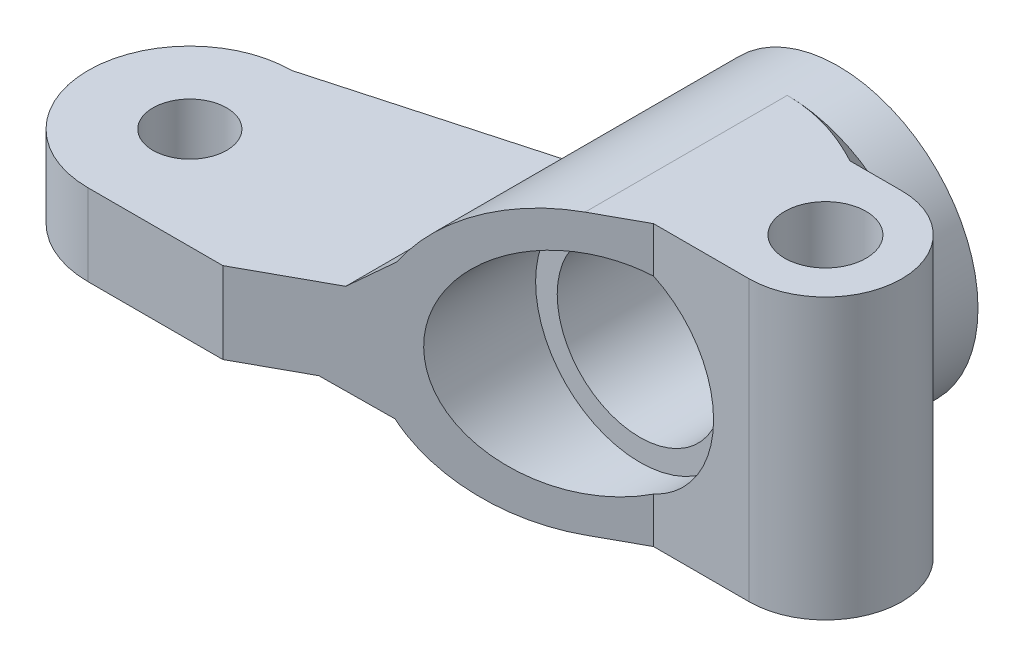
ISO-10303-21;
HEADER;
FILE_DESCRIPTION(('STEP AP214'),'2;1');
FILE_NAME('part.step','',(''),(''),'','','');
FILE_SCHEMA(('AUTOMOTIVE_DESIGN { 1 0 10303 214 1 1 1 1 }'));
ENDSEC;
DATA;
#1=APPLICATION_CONTEXT('core data for automotive mechanical design processes');
#2=APPLICATION_PROTOCOL_DEFINITION('international standard','automotive_design',2000,#1);
#3=PRODUCT_CONTEXT('',#1,'mechanical');
#4=PRODUCT('Part','Part','',(#3));
#5=PRODUCT_RELATED_PRODUCT_CATEGORY('part','',(#4));
#6=PRODUCT_DEFINITION_FORMATION('','',#4);
#7=PRODUCT_DEFINITION_CONTEXT('part definition',#1,'design');
#8=PRODUCT_DEFINITION('design','',#6,#7);
#9=PRODUCT_DEFINITION_SHAPE('','',#8);
#10=(LENGTH_UNIT() NAMED_UNIT(*) SI_UNIT(.MILLI.,.METRE.));
#11=(NAMED_UNIT(*) PLANE_ANGLE_UNIT() SI_UNIT($,.RADIAN.));
#12=(NAMED_UNIT(*) SI_UNIT($,.STERADIAN.) SOLID_ANGLE_UNIT());
#13=UNCERTAINTY_MEASURE_WITH_UNIT(LENGTH_MEASURE(1.E-05),#10,'distance_accuracy_value','');
#14=(GEOMETRIC_REPRESENTATION_CONTEXT(3) GLOBAL_UNCERTAINTY_ASSIGNED_CONTEXT((#13)) GLOBAL_UNIT_ASSIGNED_CONTEXT((#10,
#11,#12)) REPRESENTATION_CONTEXT('',''));
#15=CARTESIAN_POINT('',(0.,0.,0.));
#16=DIRECTION('',(0.,0.,1.));
#17=DIRECTION('',(1.,0.,0.));
#18=AXIS2_PLACEMENT_3D('',#15,#16,#17);
#19=CARTESIAN_POINT('',(0.,0.,9.));
#20=DIRECTION('',(0.,0.,-1.));
#21=DIRECTION('',(-1.,0.,0.));
#22=AXIS2_PLACEMENT_3D('',#19,#20,#21);
#23=CYLINDRICAL_SURFACE('',#22,5.5);
#24=CARTESIAN_POINT('',(0.,0.,0.));
#25=DIRECTION('',(0.,0.,1.));
#26=DIRECTION('',(1.,0.,0.));
#27=AXIS2_PLACEMENT_3D('',#24,#25,#26);
#28=CIRCLE('',#27,5.5);
#29=CARTESIAN_POINT('',(5.5,0.,0.));
#30=VERTEX_POINT('',#29);
#31=EDGE_CURVE('E197',#30,#30,#28,.T.);
#32=ORIENTED_EDGE('',*,*,#31,.T.);
#33=EDGE_LOOP('',(#32));
#34=FACE_BOUND('',#33,.T.);
#35=DIRECTION('',(0.,0.,-1.));
#36=VECTOR('',#35,1.);
#37=CARTESIAN_POINT('',(0.,-5.5,11.9619980292611));
#38=LINE('',#37,#36);
#39=CARTESIAN_POINT('',(0.,-5.5,9.95427089628572));
#40=VERTEX_POINT('',#39);
#41=CARTESIAN_POINT('',(0.,-5.5,9.));
#42=VERTEX_POINT('',#41);
#43=EDGE_CURVE('E163',#40,#42,#38,.T.);
#44=ORIENTED_EDGE('',*,*,#43,.F.);
#45=CARTESIAN_POINT('',(0.,0.,9.95427089628575));
#46=DIRECTION('',(-0.480778773222321,0.,-0.876841930577479));
#47=DIRECTION('',(0.876841930577479,0.,-0.480778773222321));
#48=AXIS2_PLACEMENT_3D('',#45,#46,#47);
#49=ELLIPSE('',#48,6.27251025321948,5.5);
#50=CARTESIAN_POINT('',(-4.82898770798391,-2.6326560193349,12.6020397873345));
#51=VERTEX_POINT('',#50);
#52=EDGE_CURVE('E395',#40,#51,#49,.T.);
#53=ORIENTED_EDGE('',*,*,#52,.T.);
#54=DIRECTION('',(0.,0.,-1.));
#55=VECTOR('',#54,1.);
#56=CARTESIAN_POINT('',(-4.82898770798391,-2.6326560193349,9.));
#57=LINE('',#56,#55);
#58=CARTESIAN_POINT('',(-4.82898770798391,-2.6326560193349,4.3136076966622));
#59=VERTEX_POINT('',#58);
#60=EDGE_CURVE('E228',#51,#59,#57,.T.);
#61=ORIENTED_EDGE('',*,*,#60,.T.);
#62=CARTESIAN_POINT('',(0.,0.,2.97222222222222));
#63=DIRECTION('',(-0.267643863786095,0.,-0.963517909629941));
#64=DIRECTION('',(0.963517909629941,0.,-0.267643863786095));
#65=AXIS2_PLACEMENT_3D('',#62,#63,#64);
#66=ELLIPSE('',#65,5.70824885041565,5.5);
#67=CARTESIAN_POINT('',(-4.77537590341258,2.72869657182811,4.29871552872572));
#68=VERTEX_POINT('',#67);
#69=EDGE_CURVE('E200',#59,#68,#66,.T.);
#70=ORIENTED_EDGE('',*,*,#69,.T.);
#71=DIRECTION('',(0.,0.,-1.));
#72=VECTOR('',#71,1.);
#73=CARTESIAN_POINT('',(-4.77537590341258,2.72869657182811,9.));
#74=LINE('',#73,#72);
#75=CARTESIAN_POINT('',(-4.77537590341258,2.72869657182811,12.572644047084));
#76=VERTEX_POINT('',#75);
#77=EDGE_CURVE('E215',#68,#76,#74,.F.);
#78=ORIENTED_EDGE('',*,*,#77,.T.);
#79=CARTESIAN_POINT('',(0.,5.5,9.95427089628575));
#80=VERTEX_POINT('',#79);
#81=EDGE_CURVE('E392',#76,#80,#49,.T.);
#82=ORIENTED_EDGE('',*,*,#81,.T.);
#83=DIRECTION('',(0.,0.,1.));
#84=VECTOR('',#83,1.);
#85=CARTESIAN_POINT('',(0.,5.5,3.));
#86=LINE('',#85,#84);
#87=CARTESIAN_POINT('',(0.,5.5,1.99999999999999));
#88=VERTEX_POINT('',#87);
#89=EDGE_CURVE('E194',#88,#80,#86,.T.);
#90=ORIENTED_EDGE('',*,*,#89,.F.);
#91=CARTESIAN_POINT('',(0.,0.,1.99999999999999));
#92=DIRECTION('',(0.,0.,-1.));
#93=DIRECTION('',(-1.,0.,0.));
#94=AXIS2_PLACEMENT_3D('',#91,#92,#93);
#95=CIRCLE('',#94,5.5);
#96=CARTESIAN_POINT('',(4.65384615384615,2.93116290511657,1.99999999999999));
#97=VERTEX_POINT('',#96);
#98=EDGE_CURVE('E367',#88,#97,#95,.T.);
#99=ORIENTED_EDGE('',*,*,#98,.T.);
#100=CARTESIAN_POINT('',(4.65384615384615,-2.93116290511657,2.));
#101=CARTESIAN_POINT('',(4.79242367768684,-2.71109960721148,2.00004102551355));
#102=CARTESIAN_POINT('',(4.91380504157328,-2.48400925720406,2.00986966331023));
#103=CARTESIAN_POINT('',(5.07118306863216,-2.1329660910317,2.0300326462132));
#104=CARTESIAN_POINT('',(5.11951413379763,-2.01421279298038,2.03768723874277));
#105=CARTESIAN_POINT('',(5.20790921148105,-1.773177739747,2.05360581380816));
#106=CARTESIAN_POINT('',(5.24797691339911,-1.65085979562731,2.06187422316114));
#107=CARTESIAN_POINT('',(5.31968753734429,-1.40273940146686,2.07792817686529));
#108=CARTESIAN_POINT('',(5.35139835616806,-1.27642135609895,2.08573502328306));
#109=CARTESIAN_POINT('',(5.405329962647,-1.02418636257063,2.0997046136123));
#110=CARTESIAN_POINT('',(5.4277878022719,-0.897532246408333,2.10591771691968));
#111=CARTESIAN_POINT('',(5.4637205338348,-0.643586232008632,2.11613718319562));
#112=CARTESIAN_POINT('',(5.4772180884975,-0.516222414326869,2.12014883844772));
#113=CARTESIAN_POINT('',(5.49531018347593,-0.260709578027451,2.12557413069014));
#114=CARTESIAN_POINT('',(5.49990481255515,-0.132560561965054,2.12698745809605));
#115=CARTESIAN_POINT('',(5.50004539721394,0.0602601161056219,2.12703058138977));
#116=CARTESIAN_POINT('',(5.49896611737367,0.124633251465998,2.12670042756418));
#117=CARTESIAN_POINT('',(5.4945298757105,0.253580775299685,2.12535228741867));
#118=CARTESIAN_POINT('',(5.49117256663852,0.318150326272588,2.12433410392294));
#119=CARTESIAN_POINT('',(5.48214781868823,0.447512602810694,2.1216264555462));
#120=CARTESIAN_POINT('',(5.47646886346099,0.512334559479001,2.11993376011963));
#121=CARTESIAN_POINT('',(5.46289670027979,0.641043549747215,2.11595002991214));
#122=CARTESIAN_POINT('',(5.45499527991826,0.705167283858078,2.11365723929993));
#123=CARTESIAN_POINT('',(5.40993155382217,1.02404877279261,2.10083308867145));
#124=CARTESIAN_POINT('',(5.35637452765942,1.27470081818159,2.08618473929753));
#125=CARTESIAN_POINT('',(5.25013205188569,1.64393274476234,2.06233584996331));
#126=CARTESIAN_POINT('',(5.21038099815652,1.76592207055714,2.05409250264647));
#127=CARTESIAN_POINT('',(5.14416880587549,1.94722100175134,2.04210812214268));
#128=CARTESIAN_POINT('',(5.12098892300197,2.00739703407693,2.03817627359681));
#129=CARTESIAN_POINT('',(5.07241798314408,2.12714715431119,2.03060018481461));
#130=CARTESIAN_POINT('',(5.04698754616359,2.18680871940976,2.0269509304025));
#131=CARTESIAN_POINT('',(4.96747341522383,2.36454023627163,2.01671104711147));
#132=CARTESIAN_POINT('',(4.91046015925416,2.48075630476287,2.01085715066829));
#133=CARTESIAN_POINT('',(4.78826055000809,2.70912005250496,2.00250144195703));
#134=CARTESIAN_POINT('',(4.72310538980974,2.8211965855584,2.00000241008942));
#135=CARTESIAN_POINT('',(4.65384615384614,2.93116290511658,2.));
#136=B_SPLINE_CURVE_WITH_KNOTS('',3,(#100,#101,#102,#103,#104,#105,#106,#107,#108,#109,#110,
#111,#112,#113,#114,#115,#116,#117,#118,#119,#120,#121,#122,#123,#124,#125,#126,#127,#128,#129,
#130,#131,#132,#133,#134,#135),.UNSPECIFIED.,.F.,.F.,(4,2,2,2,2,2,2,2,2,2,2,2,2,2,2,2,2,4),(0.,
0.000910077975676144,0.00136511696351422,0.00182015595135229,0.00227519493919036,
0.00273023392702843,0.00318527291486651,0.00364031190270458,0.00386783139662361,
0.00409535089054265,0.00432287038446169,0.00455038987838072,0.00546046785405687,
0.00591550684189494,0.00614302633581398,0.00637054582973301,0.00682558481757108,
0.00728062380540916),.UNSPECIFIED.);
#137=CARTESIAN_POINT('',(4.65384615384615,-2.93116290511657,2.));
#138=VERTEX_POINT('',#137);
#139=EDGE_CURVE('E501',#97,#138,#136,.F.);
#140=ORIENTED_EDGE('',*,*,#139,.T.);
#141=CARTESIAN_POINT('',(0.,0.,1.99999999999999));
#142=DIRECTION('',(0.,0.,-1.));
#143=DIRECTION('',(-1.,0.,0.));
#144=AXIS2_PLACEMENT_3D('',#141,#142,#143);
#145=CIRCLE('',#144,5.5);
#146=CARTESIAN_POINT('',(0.,-5.5,1.99999999999999));
#147=VERTEX_POINT('',#146);
#148=EDGE_CURVE('E188',#138,#147,#145,.T.);
#149=ORIENTED_EDGE('',*,*,#148,.T.);
#150=DIRECTION('',(0.,0.,-1.));
#151=VECTOR('',#150,1.);
#152=CARTESIAN_POINT('',(0.,-5.5,9.));
#153=LINE('',#152,#151);
#154=EDGE_CURVE('E181',#42,#147,#153,.T.);
#155=ORIENTED_EDGE('',*,*,#154,.F.);
#156=EDGE_LOOP('',(#44,#53,#61,#70,#78,#82,#90,#99,#140,#149,#155));
#157=FACE_BOUND('',#156,.T.);
#158=ADVANCED_FACE('F35',(#34,#157),#23,.T.);
#159=CARTESIAN_POINT('',(0.,0.,9.));
#160=DIRECTION('',(0.,0.,1.));
#161=DIRECTION('',(1.,0.,0.));
#162=AXIS2_PLACEMENT_3D('',#159,#160,#161);
#163=PLANE('',#162);
#164=DIRECTION('',(0.,1.,0.));
#165=VECTOR('',#164,1.);
#166=CARTESIAN_POINT('',(1.74039450490917,-5.5,9.));
#167=LINE('',#166,#165);
#168=CARTESIAN_POINT('',(1.74039450490917,-5.5,9.));
#169=VERTEX_POINT('',#168);
#170=CARTESIAN_POINT('',(1.74039450490917,-3.71228056149882,9.));
#171=VERTEX_POINT('',#170);
#172=EDGE_CURVE('E54',#169,#171,#167,.T.);
#173=ORIENTED_EDGE('',*,*,#172,.F.);
#174=DIRECTION('',(1.,0.,0.));
#175=VECTOR('',#174,1.);
#176=CARTESIAN_POINT('',(0.,-5.5,9.));
#177=LINE('',#176,#175);
#178=EDGE_CURVE('E165',#42,#169,#177,.T.);
#179=ORIENTED_EDGE('',*,*,#178,.F.);
#180=DIRECTION('',(0.,1.,0.));
#181=VECTOR('',#180,1.);
#182=CARTESIAN_POINT('',(0.,-5.501,9.));
#183=LINE('',#182,#181);
#184=CARTESIAN_POINT('',(0.,-5.501,9.));
#185=VERTEX_POINT('',#184);
#186=EDGE_CURVE('E175',#185,#42,#183,.T.);
#187=ORIENTED_EDGE('',*,*,#186,.F.);
#188=DIRECTION('',(1.,0.,0.));
#189=VECTOR('',#188,1.);
#190=CARTESIAN_POINT('',(5.5,-5.501,9.));
#191=LINE('',#190,#189);
#192=CARTESIAN_POINT('',(5.5,-5.501,9.));
#193=VERTEX_POINT('',#192);
#194=EDGE_CURVE('E185',#185,#193,#191,.T.);
#195=ORIENTED_EDGE('',*,*,#194,.T.);
#196=DIRECTION('',(0.,1.,0.));
#197=VECTOR('',#196,1.);
#198=CARTESIAN_POINT('',(5.5,-5.501,9.));
#199=LINE('',#198,#197);
#200=CARTESIAN_POINT('',(5.5,5.5,9.));
#201=VERTEX_POINT('',#200);
#202=EDGE_CURVE('E249',#193,#201,#199,.T.);
#203=ORIENTED_EDGE('',*,*,#202,.T.);
#204=DIRECTION('',(1.,0.,0.));
#205=VECTOR('',#204,1.);
#206=CARTESIAN_POINT('',(5.5,5.5,9.));
#207=LINE('',#206,#205);
#208=CARTESIAN_POINT('',(1.74039450490917,5.5,9.));
#209=VERTEX_POINT('',#208);
#210=EDGE_CURVE('E207',#209,#201,#207,.T.);
#211=ORIENTED_EDGE('',*,*,#210,.F.);
#212=CARTESIAN_POINT('',(1.74039450490917,3.71228056149881,9.));
#213=VERTEX_POINT('',#212);
#214=EDGE_CURVE('E62',#213,#209,#167,.T.);
#215=ORIENTED_EDGE('',*,*,#214,.F.);
#216=CARTESIAN_POINT('',(0.,0.,9.));
#217=DIRECTION('',(0.,0.,1.));
#218=DIRECTION('',(1.,0.,0.));
#219=AXIS2_PLACEMENT_3D('',#216,#217,#218);
#220=CIRCLE('',#219,4.1);
#221=EDGE_CURVE('E447',#213,#171,#220,.F.);
#222=ORIENTED_EDGE('',*,*,#221,.T.);
#223=EDGE_LOOP('',(#173,#179,#187,#195,#203,#211,#215,#222));
#224=FACE_BOUND('',#223,.T.);
#225=ADVANCED_FACE('F173',(#224),#163,.T.);
#226=CARTESIAN_POINT('',(0.,-1.6,0.));
#227=DIRECTION('',(0.,1.,0.));
#228=DIRECTION('',(0.,0.,1.));
#229=AXIS2_PLACEMENT_3D('',#226,#227,#228);
#230=PLANE('',#229);
#231=CARTESIAN_POINT('',(-14.5,-1.6,11.));
#232=DIRECTION('',(0.,1.,0.));
#233=DIRECTION('',(0.,0.,1.));
#234=AXIS2_PLACEMENT_3D('',#231,#232,#233);
#235=CIRCLE('',#234,1.45);
#236=CARTESIAN_POINT('',(-14.5,-1.6,12.45));
#237=VERTEX_POINT('',#236);
#238=EDGE_CURVE('E413',#237,#237,#235,.T.);
#239=ORIENTED_EDGE('',*,*,#238,.T.);
#240=EDGE_LOOP('',(#239));
#241=FACE_BOUND('',#240,.T.);
#242=DIRECTION('',(-0.963517909629941,0.,0.267643863786095));
#243=VECTOR('',#242,1.);
#244=CARTESIAN_POINT('',(0.766475644699141,-1.6,2.75931232091691));
#245=LINE('',#244,#243);
#246=CARTESIAN_POINT('',(-6.76398752791641,-1.6,4.85110764664345));
#247=VERTEX_POINT('',#246);
#248=CARTESIAN_POINT('',(-14.5,-1.6,7.));
#249=VERTEX_POINT('',#248);
#250=EDGE_CURVE('E416',#247,#249,#245,.T.);
#251=ORIENTED_EDGE('',*,*,#250,.F.);
#252=DIRECTION('',(0.,0.,1.));
#253=VECTOR('',#252,1.);
#254=CARTESIAN_POINT('',(-6.76398752791641,-1.6,12.8395342068819));
#255=LINE('',#254,#253);
#256=CARTESIAN_POINT('',(-6.76398752791641,-1.6,13.6630141855363));
#257=VERTEX_POINT('',#256);
#258=EDGE_CURVE('E225',#247,#257,#255,.T.);
#259=ORIENTED_EDGE('',*,*,#258,.T.);
#260=DIRECTION('',(-0.876841930577479,0.,0.480778773222321));
#261=VECTOR('',#260,1.);
#262=CARTESIAN_POINT('',(4.1963919964266,-1.6,7.65335880980145));
#263=LINE('',#262,#261);
#264=CARTESIAN_POINT('',(-9.20237559328748,-1.6,15.));
#265=VERTEX_POINT('',#264);
#266=EDGE_CURVE('E396',#257,#265,#263,.T.);
#267=ORIENTED_EDGE('',*,*,#266,.T.);
#268=DIRECTION('',(1.,0.,0.));
#269=VECTOR('',#268,1.);
#270=CARTESIAN_POINT('',(0.,-1.6,15.));
#271=LINE('',#270,#269);
#272=CARTESIAN_POINT('',(-14.5,-1.6,15.));
#273=VERTEX_POINT('',#272);
#274=EDGE_CURVE('E421',#273,#265,#271,.T.);
#275=ORIENTED_EDGE('',*,*,#274,.F.);
#276=CARTESIAN_POINT('',(-14.5,-1.6,11.));
#277=DIRECTION('',(0.,1.,0.));
#278=DIRECTION('',(0.,0.,1.));
#279=AXIS2_PLACEMENT_3D('',#276,#277,#278);
#280=CIRCLE('',#279,4.);
#281=EDGE_CURVE('E418',#249,#273,#280,.T.);
#282=ORIENTED_EDGE('',*,*,#281,.F.);
#283=EDGE_LOOP('',(#251,#259,#267,#275,#282));
#284=FACE_BOUND('',#283,.T.);
#285=ADVANCED_FACE('F487',(#241,#284),#230,.F.);
#286=CARTESIAN_POINT('',(0.,1.6,0.));
#287=DIRECTION('',(0.,1.,0.));
#288=DIRECTION('',(0.,0.,1.));
#289=AXIS2_PLACEMENT_3D('',#286,#287,#288);
#290=PLANE('',#289);
#291=DIRECTION('',(-0.876841930577479,0.,0.480778773222321));
#292=VECTOR('',#291,1.);
#293=CARTESIAN_POINT('',(4.1963919964266,1.6,7.65335880980145));
#294=LINE('',#293,#292);
#295=CARTESIAN_POINT('',(-6.07936495000926,1.6,13.2876306738129));
#296=VERTEX_POINT('',#295);
#297=CARTESIAN_POINT('',(-9.20237559328748,1.6,15.));
#298=VERTEX_POINT('',#297);
#299=EDGE_CURVE('E399',#296,#298,#294,.T.);
#300=ORIENTED_EDGE('',*,*,#299,.F.);
#301=DIRECTION('',(0.,0.,-1.));
#302=VECTOR('',#301,1.);
#303=CARTESIAN_POINT('',(-6.07936495000926,1.6,0.));
#304=LINE('',#303,#302);
#305=CARTESIAN_POINT('',(-6.07936495000926,1.6,4.66093470833591));
#306=VERTEX_POINT('',#305);
#307=EDGE_CURVE('E218',#296,#306,#304,.T.);
#308=ORIENTED_EDGE('',*,*,#307,.T.);
#309=DIRECTION('',(-0.963517909629941,0.,0.267643863786095));
#310=VECTOR('',#309,1.);
#311=CARTESIAN_POINT('',(0.766475644699141,1.6,2.75931232091691));
#312=LINE('',#311,#310);
#313=CARTESIAN_POINT('',(-14.5,1.6,7.));
#314=VERTEX_POINT('',#313);
#315=EDGE_CURVE('E405',#306,#314,#312,.T.);
#316=ORIENTED_EDGE('',*,*,#315,.T.);
#317=CARTESIAN_POINT('',(-14.5,1.6,11.));
#318=DIRECTION('',(0.,1.,0.));
#319=DIRECTION('',(0.,0.,1.));
#320=AXIS2_PLACEMENT_3D('',#317,#318,#319);
#321=CIRCLE('',#320,4.);
#322=CARTESIAN_POINT('',(-14.5,1.6,15.));
#323=VERTEX_POINT('',#322);
#324=EDGE_CURVE('E407',#314,#323,#321,.T.);
#325=ORIENTED_EDGE('',*,*,#324,.T.);
#326=DIRECTION('',(1.,0.,0.));
#327=VECTOR('',#326,1.);
#328=CARTESIAN_POINT('',(0.,1.6,15.));
#329=LINE('',#328,#327);
#330=EDGE_CURVE('E410',#323,#298,#329,.T.);
#331=ORIENTED_EDGE('',*,*,#330,.T.);
#332=EDGE_LOOP('',(#300,#308,#316,#325,#331));
#333=FACE_BOUND('',#332,.T.);
#334=CARTESIAN_POINT('',(-14.5,1.6,11.));
#335=DIRECTION('',(0.,1.,0.));
#336=DIRECTION('',(0.,0.,1.));
#337=AXIS2_PLACEMENT_3D('',#334,#335,#336);
#338=CIRCLE('',#337,1.45);
#339=CARTESIAN_POINT('',(-14.5,1.6,12.45));
#340=VERTEX_POINT('',#339);
#341=EDGE_CURVE('E398',#340,#340,#338,.T.);
#342=ORIENTED_EDGE('',*,*,#341,.F.);
#343=EDGE_LOOP('',(#342));
#344=FACE_BOUND('',#343,.T.);
#345=ADVANCED_FACE('F437',(#333,#344),#290,.T.);
#346=CARTESIAN_POINT('',(0.,0.,9.));
#347=DIRECTION('',(0.,0.,-1.));
#348=DIRECTION('',(-1.,0.,0.));
#349=AXIS2_PLACEMENT_3D('',#346,#347,#348);
#350=CYLINDRICAL_SURFACE('',#349,3.25);
#351=CARTESIAN_POINT('',(0.,0.,2.2));
#352=DIRECTION('',(0.,0.,-1.));
#353=DIRECTION('',(-1.,0.,0.));
#354=AXIS2_PLACEMENT_3D('',#351,#352,#353);
#355=CIRCLE('',#354,3.25);
#356=CARTESIAN_POINT('',(-3.25,0.,2.2));
#357=VERTEX_POINT('',#356);
#358=EDGE_CURVE('E201',#357,#357,#355,.T.);
#359=ORIENTED_EDGE('',*,*,#358,.T.);
#360=EDGE_LOOP('',(#359));
#361=FACE_BOUND('',#360,.T.);
#362=CARTESIAN_POINT('',(0.,0.,7.8));
#363=DIRECTION('',(0.,0.,1.));
#364=DIRECTION('',(1.,0.,0.));
#365=AXIS2_PLACEMENT_3D('',#362,#363,#364);
#366=CIRCLE('',#365,3.25);
#367=CARTESIAN_POINT('',(3.25,0.,7.8));
#368=VERTEX_POINT('',#367);
#369=EDGE_CURVE('E204',#368,#368,#366,.T.);
#370=ORIENTED_EDGE('',*,*,#369,.T.);
#371=EDGE_LOOP('',(#370));
#372=FACE_BOUND('',#371,.T.);
#373=ADVANCED_FACE('F527',(#361,#372),#350,.F.);
#374=CARTESIAN_POINT('',(0.,0.,0.));
#375=DIRECTION('',(0.,0.,1.));
#376=DIRECTION('',(1.,0.,0.));
#377=AXIS2_PLACEMENT_3D('',#374,#375,#376);
#378=PLANE('',#377);
#379=CARTESIAN_POINT('',(0.,0.,0.));
#380=DIRECTION('',(0.,0.,1.));
#381=DIRECTION('',(1.,0.,0.));
#382=AXIS2_PLACEMENT_3D('',#379,#380,#381);
#383=CIRCLE('',#382,4.1);
#384=CARTESIAN_POINT('',(4.1,0.,0.));
#385=VERTEX_POINT('',#384);
#386=EDGE_CURVE('E452',#385,#385,#383,.T.);
#387=ORIENTED_EDGE('',*,*,#386,.T.);
#388=EDGE_LOOP('',(#387));
#389=FACE_BOUND('',#388,.T.);
#390=ORIENTED_EDGE('',*,*,#31,.F.);
#391=EDGE_LOOP('',(#390));
#392=FACE_BOUND('',#391,.T.);
#393=ADVANCED_FACE('F491',(#389,#392),#378,.F.);
#394=CARTESIAN_POINT('',(0.,0.,2.2));
#395=DIRECTION('',(0.,0.,-1.));
#396=DIRECTION('',(-1.,0.,0.));
#397=AXIS2_PLACEMENT_3D('',#394,#395,#396);
#398=PLANE('',#397);
#399=ORIENTED_EDGE('',*,*,#358,.F.);
#400=EDGE_LOOP('',(#399));
#401=FACE_BOUND('',#400,.T.);
#402=CARTESIAN_POINT('',(0.,0.,2.2));
#403=DIRECTION('',(0.,0.,-1.));
#404=DIRECTION('',(-1.,0.,0.));
#405=AXIS2_PLACEMENT_3D('',#402,#403,#404);
#406=CIRCLE('',#405,4.1);
#407=CARTESIAN_POINT('',(-4.1,0.,2.2));
#408=VERTEX_POINT('',#407);
#409=EDGE_CURVE('E455',#408,#408,#406,.T.);
#410=ORIENTED_EDGE('',*,*,#409,.T.);
#411=EDGE_LOOP('',(#410));
#412=FACE_BOUND('',#411,.T.);
#413=ADVANCED_FACE('F522',(#401,#412),#398,.T.);
#414=CARTESIAN_POINT('',(0.,0.,7.8));
#415=DIRECTION('',(0.,0.,1.));
#416=DIRECTION('',(1.,0.,0.));
#417=AXIS2_PLACEMENT_3D('',#414,#415,#416);
#418=PLANE('',#417);
#419=ORIENTED_EDGE('',*,*,#369,.F.);
#420=EDGE_LOOP('',(#419));
#421=FACE_BOUND('',#420,.T.);
#422=CARTESIAN_POINT('',(0.,0.,7.8));
#423=DIRECTION('',(0.,0.,1.));
#424=DIRECTION('',(1.,0.,0.));
#425=AXIS2_PLACEMENT_3D('',#422,#423,#424);
#426=CIRCLE('',#425,4.1);
#427=CARTESIAN_POINT('',(4.1,0.,7.8));
#428=VERTEX_POINT('',#427);
#429=EDGE_CURVE('E449',#428,#428,#426,.T.);
#430=ORIENTED_EDGE('',*,*,#429,.T.);
#431=EDGE_LOOP('',(#430));
#432=FACE_BOUND('',#431,.T.);
#433=ADVANCED_FACE('F519',(#421,#432),#418,.T.);
#434=CARTESIAN_POINT('',(0.,-5.501,3.));
#435=DIRECTION('',(-1.,0.,0.));
#436=DIRECTION('',(0.,0.,1.));
#437=AXIS2_PLACEMENT_3D('',#434,#435,#436);
#438=PLANE('',#437);
#439=ORIENTED_EDGE('',*,*,#186,.T.);
#440=ORIENTED_EDGE('',*,*,#154,.T.);
#441=DIRECTION('',(0.,-0.70710678118655,0.707106781186545));
#442=VECTOR('',#441,1.);
#443=CARTESIAN_POINT('',(0.,0.,-3.49999999999997));
#444=LINE('',#443,#442);
#445=CARTESIAN_POINT('',(0.,-5.501,2.001));
#446=VERTEX_POINT('',#445);
#447=EDGE_CURVE('E509',#147,#446,#444,.T.);
#448=ORIENTED_EDGE('',*,*,#447,.T.);
#449=DIRECTION('',(0.,0.,1.));
#450=VECTOR('',#449,1.);
#451=CARTESIAN_POINT('',(0.,-5.501,3.));
#452=LINE('',#451,#450);
#453=EDGE_CURVE('E183',#446,#185,#452,.T.);
#454=ORIENTED_EDGE('',*,*,#453,.T.);
#455=EDGE_LOOP('',(#439,#440,#448,#454));
#456=FACE_BOUND('',#455,.T.);
#457=ADVANCED_FACE('F179',(#456),#438,.T.);
#458=CARTESIAN_POINT('',(5.5,-5.501,3.));
#459=DIRECTION('',(0.,0.,-1.));
#460=DIRECTION('',(-1.,0.,0.));
#461=AXIS2_PLACEMENT_3D('',#458,#459,#460);
#462=PLANE('',#461);
#463=DIRECTION('',(-1.,0.,0.));
#464=VECTOR('',#463,1.);
#465=CARTESIAN_POINT('',(5.5,-5.501,3.));
#466=LINE('',#465,#464);
#467=CARTESIAN_POINT('',(5.5,-5.501,3.));
#468=VERTEX_POINT('',#467);
#469=CARTESIAN_POINT('',(3.46251339347592,-5.501,3.));
#470=VERTEX_POINT('',#469);
#471=EDGE_CURVE('E191',#468,#470,#466,.T.);
#472=ORIENTED_EDGE('',*,*,#471,.T.);
#473=CARTESIAN_POINT('',(0.,0.,3.));
#474=DIRECTION('',(0.,0.,-1.));
#475=DIRECTION('',(-1.,0.,0.));
#476=AXIS2_PLACEMENT_3D('',#473,#474,#475);
#477=CIRCLE('',#476,6.50000000000001);
#478=CARTESIAN_POINT('',(5.5,-3.46410161513778,3.));
#479=VERTEX_POINT('',#478);
#480=EDGE_CURVE('E236',#470,#479,#477,.F.);
#481=ORIENTED_EDGE('',*,*,#480,.T.);
#482=DIRECTION('',(0.,1.,0.));
#483=VECTOR('',#482,1.);
#484=CARTESIAN_POINT('',(5.5,-5.501,3.));
#485=LINE('',#484,#483);
#486=EDGE_CURVE('E237',#468,#479,#485,.T.);
#487=ORIENTED_EDGE('',*,*,#486,.F.);
#488=EDGE_LOOP('',(#472,#481,#487));
#489=FACE_BOUND('',#488,.T.);
#490=ADVANCED_FACE('F370',(#489),#462,.T.);
#491=CARTESIAN_POINT('',(5.5,3.46410161513778,3.));
#492=VERTEX_POINT('',#491);
#493=CARTESIAN_POINT('',(5.5,5.5,3.));
#494=VERTEX_POINT('',#493);
#495=EDGE_CURVE('E241',#492,#494,#485,.T.);
#496=ORIENTED_EDGE('',*,*,#495,.F.);
#497=CARTESIAN_POINT('',(0.,0.,3.));
#498=DIRECTION('',(0.,0.,-1.));
#499=DIRECTION('',(-1.,0.,0.));
#500=AXIS2_PLACEMENT_3D('',#497,#498,#499);
#501=CIRCLE('',#500,6.50000000000001);
#502=CARTESIAN_POINT('',(3.46410161513777,5.5,3.));
#503=VERTEX_POINT('',#502);
#504=EDGE_CURVE('E505',#492,#503,#501,.F.);
#505=ORIENTED_EDGE('',*,*,#504,.T.);
#506=DIRECTION('',(-1.,0.,0.));
#507=VECTOR('',#506,1.);
#508=CARTESIAN_POINT('',(5.5,5.5,3.));
#509=LINE('',#508,#507);
#510=EDGE_CURVE('E383',#494,#503,#509,.T.);
#511=ORIENTED_EDGE('',*,*,#510,.F.);
#512=EDGE_LOOP('',(#496,#505,#511));
#513=FACE_BOUND('',#512,.T.);
#514=ADVANCED_FACE('F277',(#513),#462,.T.);
#515=CARTESIAN_POINT('',(5.5,-5.501,6.));
#516=DIRECTION('',(0.,1.,0.));
#517=DIRECTION('',(0.,0.,1.));
#518=AXIS2_PLACEMENT_3D('',#515,#516,#517);
#519=CYLINDRICAL_SURFACE('',#518,3.);
#520=ORIENTED_EDGE('',*,*,#486,.T.);
#521=CARTESIAN_POINT('',(5.5,3.46410161513778,3.));
#522=CARTESIAN_POINT('',(5.56138886824046,3.3341414192963,3.00000180756707));
#523=CARTESIAN_POINT('',(5.61914003296605,3.20168733476783,3.00187608146802));
#524=CARTESIAN_POINT('',(5.72745332297096,2.93180290563961,3.00814286300097));
#525=CARTESIAN_POINT('',(5.77798779985955,2.79445664286034,3.01253328533383));
#526=CARTESIAN_POINT('',(5.84846623409852,2.58441030476006,3.02021319780176));
#527=CARTESIAN_POINT('',(5.871006848696,2.51390118236745,3.02295013861097));
#528=CARTESIAN_POINT('',(5.91405836356984,2.37237831300034,3.02863220519759));
#529=CARTESIAN_POINT('',(5.93460416884515,2.30126118388445,3.03158109160716));
#530=CARTESIAN_POINT('',(5.99329224836409,2.08699881066545,3.04056937698456));
#531=CARTESIAN_POINT('',(6.02852613700215,1.94282960696694,3.04675188749213));
#532=CARTESIAN_POINT('',(6.12269560385483,1.50646460426444,3.06463855443385));
#533=CARTESIAN_POINT('',(6.17016660480935,1.21023945606603,3.07562481657225));
#534=CARTESIAN_POINT('',(6.21010945258354,0.83337951795904,3.08524292945779));
#535=CARTESIAN_POINT('',(6.2171129843392,0.757596922424886,3.08696252243418));
#536=CARTESIAN_POINT('',(6.22914285624923,0.605486297569735,3.08995032008966));
#537=CARTESIAN_POINT('',(6.23417647565561,0.528878530592062,3.09121984165967));
#538=CARTESIAN_POINT('',(6.24217568406584,0.375995840142726,3.09325057794218));
#539=CARTESIAN_POINT('',(6.24515148074341,0.29968637080859,3.09401421556401));
#540=CARTESIAN_POINT('',(6.24908360403575,0.147293842641763,3.09502532067314));
#541=CARTESIAN_POINT('',(6.25004023843963,0.0712165008468355,3.09527293604233));
#542=CARTESIAN_POINT('',(6.24991562931026,-0.156662482311815,3.09524059357204));
#543=CARTESIAN_POINT('',(6.24584311717109,-0.308111319501503,3.09418059801741));
#544=CARTESIAN_POINT('',(6.22980694207811,-0.610081035099063,3.09011162883599));
#545=CARTESIAN_POINT('',(6.21784320044294,-0.760601910570259,3.08710288739635));
#546=CARTESIAN_POINT('',(6.18599373383346,-1.06071992755889,3.07943828769013));
#547=CARTESIAN_POINT('',(6.16608792142163,-1.21040206495282,3.07477846020583));
#548=CARTESIAN_POINT('',(6.11828490661901,-1.50849796620215,3.0643012674657));
#549=CARTESIAN_POINT('',(6.09017758990428,-1.65778292907336,3.05844613264621));
#550=CARTESIAN_POINT('',(6.02661590052739,-1.95101612203793,3.04640566737362));
#551=CARTESIAN_POINT('',(5.99110134653797,-2.09557369243575,3.04020436035581));
#552=CARTESIAN_POINT('',(5.91275116404996,-2.38043330078752,3.02826542905739));
#553=CARTESIAN_POINT('',(5.86991226521949,-2.52077810805586,3.02252448464267));
#554=CARTESIAN_POINT('',(5.73041810534891,-2.93564730302257,3.00740224751715));
#555=CARTESIAN_POINT('',(5.62283007794971,-3.20402680852267,3.00003076913516));
#556=CARTESIAN_POINT('',(5.5,-3.46410161513778,3.));
#557=B_SPLINE_CURVE_WITH_KNOTS('',3,(#521,#522,#523,#524,#525,#526,#527,#528,#529,#530,#531,
#532,#533,#534,#535,#536,#537,#538,#539,#540,#541,#542,#543,#544,#545,#546,#547,#548,#549,#550,
#551,#552,#553,#554,#555,#556),.UNSPECIFIED.,.F.,.F.,(4,2,2,2,2,2,2,2,2,2,2,2,2,2,2,2,2,4),(0.,
0.000455038987838072,0.000910077975676145,0.00113759746959518,0.00136511696351422,
0.00182015595135229,0.00273023392702843,0.00295775342094747,0.00318527291486651,
0.00341279240878554,0.00364031190270458,0.00409535089054265,0.00455038987838072,
0.0050054288662188,0.00546046785405687,0.00591550684189494,0.00637054582973301,
0.00728062380540916),.UNSPECIFIED.);
#558=EDGE_CURVE('E259',#479,#492,#557,.F.);
#559=ORIENTED_EDGE('',*,*,#558,.T.);
#560=ORIENTED_EDGE('',*,*,#495,.T.);
#561=CARTESIAN_POINT('',(5.5,5.5,6.));
#562=DIRECTION('',(0.,1.,0.));
#563=DIRECTION('',(0.,0.,1.));
#564=AXIS2_PLACEMENT_3D('',#561,#562,#563);
#565=CIRCLE('',#564,3.);
#566=EDGE_CURVE('E254',#201,#494,#565,.T.);
#567=ORIENTED_EDGE('',*,*,#566,.F.);
#568=ORIENTED_EDGE('',*,*,#202,.F.);
#569=CARTESIAN_POINT('',(5.5,-5.501,6.));
#570=DIRECTION('',(0.,1.,0.));
#571=DIRECTION('',(0.,0.,1.));
#572=AXIS2_PLACEMENT_3D('',#569,#570,#571);
#573=CIRCLE('',#572,3.);
#574=EDGE_CURVE('E242',#193,#468,#573,.T.);
#575=ORIENTED_EDGE('',*,*,#574,.T.);
#576=EDGE_LOOP('',(#520,#559,#560,#567,#568,#575));
#577=FACE_BOUND('',#576,.T.);
#578=ADVANCED_FACE('F266',(#577),#519,.T.);
#579=CARTESIAN_POINT('',(5.5,-5.501,6.));
#580=DIRECTION('',(0.,1.,0.));
#581=DIRECTION('',(0.,0.,1.));
#582=AXIS2_PLACEMENT_3D('',#579,#580,#581);
#583=PLANE('',#582);
#584=CARTESIAN_POINT('',(5.5,-5.501,6.));
#585=DIRECTION('',(0.,1.,0.));
#586=DIRECTION('',(0.,0.,1.));
#587=AXIS2_PLACEMENT_3D('',#584,#585,#586);
#588=CIRCLE('',#587,1.6);
#589=CARTESIAN_POINT('',(5.5,-5.501,7.6));
#590=VERTEX_POINT('',#589);
#591=EDGE_CURVE('E458',#590,#590,#588,.F.);
#592=ORIENTED_EDGE('',*,*,#591,.F.);
#593=EDGE_LOOP('',(#592));
#594=FACE_BOUND('',#593,.T.);
#595=ORIENTED_EDGE('',*,*,#574,.F.);
#596=ORIENTED_EDGE('',*,*,#194,.F.);
#597=ORIENTED_EDGE('',*,*,#453,.F.);
#598=CARTESIAN_POINT('',(0.,-5.501,2.001));
#599=CARTESIAN_POINT('',(0.0845176035804994,-5.501,2.00099321739423));
#600=CARTESIAN_POINT('',(0.169022602124891,-5.501,2.0029487734903));
#601=CARTESIAN_POINT('',(0.337841856588298,-5.501,2.01072071378934));
#602=CARTESIAN_POINT('',(0.422156140657192,-5.501,2.01653648505671));
#603=CARTESIAN_POINT('',(0.67426144099118,-5.501,2.03964783126959));
#604=CARTESIAN_POINT('',(0.841561125857835,-5.501,2.06260796116121));
#605=CARTESIAN_POINT('',(1.170989318983,-5.501,2.12195095915891));
#606=CARTESIAN_POINT('',(1.3331577792658,-5.501,2.15811784344361));
#607=CARTESIAN_POINT('',(1.65442374901082,-5.501,2.24230527884594));
#608=CARTESIAN_POINT('',(1.81352010868491,-5.501,2.29033017875021));
#609=CARTESIAN_POINT('',(2.09889098800185,-5.501,2.38657891393352));
#610=CARTESIAN_POINT('',(2.22575082834956,-5.501,2.43309371587718));
#611=CARTESIAN_POINT('',(2.47717384745222,-5.501,2.53191796407994));
#612=CARTESIAN_POINT('',(2.60173720911512,-5.501,2.58422694650315));
#613=CARTESIAN_POINT('',(2.85029814915322,-5.501,2.69456333906093));
#614=CARTESIAN_POINT('',(2.97426557768189,-5.501,2.75265820608859));
#615=CARTESIAN_POINT('',(3.21999587091854,-5.501,2.87322310309474));
#616=CARTESIAN_POINT('',(3.34175961967147,-5.501,2.93569132736065));
#617=CARTESIAN_POINT('',(3.46251339347592,-5.501,3.));
#618=B_SPLINE_CURVE_WITH_KNOTS('',3,(#598,#599,#600,#601,#602,#603,#604,#605,#606,#607,#608,
#609,#610,#611,#612,#613,#614,#615,#616,#617),.UNSPECIFIED.,.F.,.F.,(4,2,2,2,2,2,2,2,2,4),(0.,
0.253506092454568,0.506971942139726,1.01286888712308,1.51083800920216,2.00899002751102,
2.41419495829017,2.81936747500276,3.22999020734158,3.64044438660623),.UNSPECIFIED.);
#619=EDGE_CURVE('E46',#446,#470,#618,.T.);
#620=ORIENTED_EDGE('',*,*,#619,.T.);
#621=ORIENTED_EDGE('',*,*,#471,.F.);
#622=EDGE_LOOP('',(#595,#596,#597,#620,#621));
#623=FACE_BOUND('',#622,.T.);
#624=ADVANCED_FACE('F276',(#594,#623),#583,.F.);
#625=CARTESIAN_POINT('',(5.5,5.5,6.));
#626=DIRECTION('',(0.,1.,0.));
#627=DIRECTION('',(0.,0.,1.));
#628=AXIS2_PLACEMENT_3D('',#625,#626,#627);
#629=PLANE('',#628);
#630=CARTESIAN_POINT('',(5.5,5.5,6.));
#631=DIRECTION('',(0.,1.,0.));
#632=DIRECTION('',(0.,0.,1.));
#633=AXIS2_PLACEMENT_3D('',#630,#631,#632);
#634=CIRCLE('',#633,1.6);
#635=CARTESIAN_POINT('',(5.5,5.5,7.6));
#636=VERTEX_POINT('',#635);
#637=EDGE_CURVE('E461',#636,#636,#634,.T.);
#638=ORIENTED_EDGE('',*,*,#637,.F.);
#639=EDGE_LOOP('',(#638));
#640=FACE_BOUND('',#639,.T.);
#641=ORIENTED_EDGE('',*,*,#566,.T.);
#642=ORIENTED_EDGE('',*,*,#510,.T.);
#643=CARTESIAN_POINT('',(3.46410161513777,5.5,3.));
#644=CARTESIAN_POINT('',(3.36639231048487,5.5,2.94793299369572));
#645=CARTESIAN_POINT('',(3.26803477504348,5.5,2.89708542638699));
#646=CARTESIAN_POINT('',(3.06989646737794,5.5,2.79816456804843));
#647=CARTESIAN_POINT('',(2.97011524485664,5.5,2.75009218017626));
#648=CARTESIAN_POINT('',(2.66772032538696,5.5,2.61021102577233));
#649=CARTESIAN_POINT('',(2.46285195615753,5.5,2.52316945670056));
#650=CARTESIAN_POINT('',(2.0521410158937,5.5,2.36737872426072));
#651=CARTESIAN_POINT('',(1.84645521756865,5.5,2.29822126616343));
#652=CARTESIAN_POINT('',(1.42984977919961,5.5,2.1793296011491));
#653=CARTESIAN_POINT('',(1.21894122602479,5.5,2.12955746867821));
#654=CARTESIAN_POINT('',(0.840833175891047,5.5,2.06153055728119));
#655=CARTESIAN_POINT('',(0.674463828044067,5.5,2.03870633028873));
#656=CARTESIAN_POINT('',(0.423098145503102,5.5,2.01560917094523));
#657=CARTESIAN_POINT('',(0.338591444805936,5.5,2.00976585651644));
#658=CARTESIAN_POINT('',(0.169393495526895,5.5,2.00195738270233));
#659=CARTESIAN_POINT('',(0.0847022342699305,5.5,1.99999249865473));
#660=CARTESIAN_POINT('',(0.,5.5,1.99999999999999));
#661=B_SPLINE_CURVE_WITH_KNOTS('',3,(#643,#644,#645,#646,#647,#648,#649,#650,#651,#652,#653,
#654,#655,#656,#657,#658,#659,#660),.UNSPECIFIED.,.F.,.F.,(4,2,2,2,2,2,2,2,4),(0.,
0.332131746596435,0.664370980166018,1.33156261056565,1.98181606925446,2.63079090057971,
3.13390574239054,3.38795081114666,3.64201391443422),.UNSPECIFIED.);
#662=EDGE_CURVE('E11',#503,#88,#661,.T.);
#663=ORIENTED_EDGE('',*,*,#662,.T.);
#664=ORIENTED_EDGE('',*,*,#89,.T.);
#665=DIRECTION('',(0.876841930577479,0.,-0.480778773222321));
#666=VECTOR('',#665,1.);
#667=CARTESIAN_POINT('',(-0.66261530338357,5.5,10.317587660197));
#668=LINE('',#667,#666);
#669=EDGE_CURVE('E387',#80,#209,#668,.T.);
#670=ORIENTED_EDGE('',*,*,#669,.T.);
#671=ORIENTED_EDGE('',*,*,#210,.T.);
#672=EDGE_LOOP('',(#641,#642,#663,#664,#670,#671));
#673=FACE_BOUND('',#672,.T.);
#674=ADVANCED_FACE('F280',(#640,#673),#629,.T.);
#675=CARTESIAN_POINT('',(0.766475644699141,-1.6,2.75931232091691));
#676=DIRECTION('',(-0.267643863786095,0.,-0.963517909629941));
#677=DIRECTION('',(-0.963517909629941,0.,0.267643863786095));
#678=AXIS2_PLACEMENT_3D('',#675,#676,#677);
#679=PLANE('',#678);
#680=ORIENTED_EDGE('',*,*,#69,.F.);
#681=DIRECTION('',(0.856873574454297,-0.45728978646629,-0.238020437348416));
#682=VECTOR('',#681,1.);
#683=CARTESIAN_POINT('',(-7.6101683248093,-1.148416653916,5.08615786800258));
#684=LINE('',#683,#682);
#685=EDGE_CURVE('E234',#59,#247,#684,.F.);
#686=ORIENTED_EDGE('',*,*,#685,.T.);
#687=ORIENTED_EDGE('',*,*,#250,.T.);
#688=DIRECTION('',(0.,1.,0.));
#689=VECTOR('',#688,1.);
#690=CARTESIAN_POINT('',(-14.5,-1.6,7.));
#691=LINE('',#690,#689);
#692=EDGE_CURVE('E247',#249,#314,#691,.T.);
#693=ORIENTED_EDGE('',*,*,#692,.T.);
#694=ORIENTED_EDGE('',*,*,#315,.F.);
#695=DIRECTION('',(-0.739954391194509,-0.640483895804318,0.205542886442919));
#696=VECTOR('',#695,1.);
#697=CARTESIAN_POINT('',(-5.49040536027233,2.1097870044356,4.49733482229787));
#698=LINE('',#697,#696);
#699=EDGE_CURVE('E222',#306,#68,#698,.F.);
#700=ORIENTED_EDGE('',*,*,#699,.T.);
#701=EDGE_LOOP('',(#680,#686,#687,#693,#694,#700));
#702=FACE_BOUND('',#701,.T.);
#703=ADVANCED_FACE('F284',(#702),#679,.T.);
#704=CARTESIAN_POINT('',(0.,-1.6,15.));
#705=DIRECTION('',(0.,0.,1.));
#706=DIRECTION('',(1.,0.,0.));
#707=AXIS2_PLACEMENT_3D('',#704,#705,#706);
#708=PLANE('',#707);
#709=DIRECTION('',(0.,-1.,0.));
#710=VECTOR('',#709,1.);
#711=CARTESIAN_POINT('',(-9.20237559328748,-1.6,15.));
#712=LINE('',#711,#710);
#713=EDGE_CURVE('E209',#298,#265,#712,.T.);
#714=ORIENTED_EDGE('',*,*,#713,.F.);
#715=ORIENTED_EDGE('',*,*,#330,.F.);
#716=DIRECTION('',(0.,1.,0.));
#717=VECTOR('',#716,1.);
#718=CARTESIAN_POINT('',(-14.5,-1.6,15.));
#719=LINE('',#718,#717);
#720=EDGE_CURVE('E423',#273,#323,#719,.T.);
#721=ORIENTED_EDGE('',*,*,#720,.F.);
#722=ORIENTED_EDGE('',*,*,#274,.T.);
#723=EDGE_LOOP('',(#714,#715,#721,#722));
#724=FACE_BOUND('',#723,.T.);
#725=ADVANCED_FACE('F441',(#724),#708,.T.);
#726=CARTESIAN_POINT('',(-14.5,-1.6,11.));
#727=DIRECTION('',(0.,1.,0.));
#728=DIRECTION('',(0.,0.,1.));
#729=AXIS2_PLACEMENT_3D('',#726,#727,#728);
#730=CYLINDRICAL_SURFACE('',#729,1.45);
#731=ORIENTED_EDGE('',*,*,#238,.F.);
#732=EDGE_LOOP('',(#731));
#733=FACE_BOUND('',#732,.T.);
#734=ORIENTED_EDGE('',*,*,#341,.T.);
#735=EDGE_LOOP('',(#734));
#736=FACE_BOUND('',#735,.T.);
#737=ADVANCED_FACE('F278',(#733,#736),#730,.F.);
#738=CARTESIAN_POINT('',(-14.5,-1.6,11.));
#739=DIRECTION('',(0.,1.,0.));
#740=DIRECTION('',(0.,0.,1.));
#741=AXIS2_PLACEMENT_3D('',#738,#739,#740);
#742=CYLINDRICAL_SURFACE('',#741,4.);
#743=ORIENTED_EDGE('',*,*,#720,.T.);
#744=ORIENTED_EDGE('',*,*,#324,.F.);
#745=ORIENTED_EDGE('',*,*,#692,.F.);
#746=ORIENTED_EDGE('',*,*,#281,.T.);
#747=EDGE_LOOP('',(#743,#744,#745,#746));
#748=FACE_BOUND('',#747,.T.);
#749=ADVANCED_FACE('F433',(#748),#742,.T.);
#750=CARTESIAN_POINT('',(1.74039450490917,-5.5,9.));
#751=DIRECTION('',(-0.480778773222321,0.,-0.876841930577479));
#752=DIRECTION('',(-0.876841930577479,0.,0.480778773222321));
#753=AXIS2_PLACEMENT_3D('',#750,#751,#752);
#754=PLANE('',#753);
#755=ORIENTED_EDGE('',*,*,#172,.T.);
#756=CARTESIAN_POINT('',(0.,0.,9.95427089628575));
#757=DIRECTION('',(-0.480778773222321,0.,-0.876841930577479));
#758=DIRECTION('',(0.876841930577479,0.,-0.480778773222321));
#759=AXIS2_PLACEMENT_3D('',#756,#757,#758);
#760=ELLIPSE('',#759,4.6758712796727,4.1);
#761=EDGE_CURVE('E212',#213,#171,#760,.F.);
#762=ORIENTED_EDGE('',*,*,#761,.F.);
#763=ORIENTED_EDGE('',*,*,#214,.T.);
#764=ORIENTED_EDGE('',*,*,#669,.F.);
#765=ORIENTED_EDGE('',*,*,#81,.F.);
#766=DIRECTION('',(0.698454839508081,0.604563040607624,-0.382967840815655));
#767=VECTOR('',#766,1.);
#768=CARTESIAN_POINT('',(-4.11574584130095,3.29965396730877,12.210964112556));
#769=LINE('',#768,#767);
#770=EDGE_CURVE('E220',#76,#296,#769,.F.);
#771=ORIENTED_EDGE('',*,*,#770,.T.);
#772=ORIENTED_EDGE('',*,*,#299,.T.);
#773=ORIENTED_EDGE('',*,*,#713,.T.);
#774=ORIENTED_EDGE('',*,*,#266,.F.);
#775=DIRECTION('',(-0.794189474241238,0.42383701156946,0.435459833541849));
#776=VECTOR('',#775,1.);
#777=CARTESIAN_POINT('',(1.52545280511259,-6.02384560899779,9.11785408879165));
#778=LINE('',#777,#776);
#779=EDGE_CURVE('E231',#257,#51,#778,.F.);
#780=ORIENTED_EDGE('',*,*,#779,.T.);
#781=ORIENTED_EDGE('',*,*,#52,.F.);
#782=DIRECTION('',(-0.876841930577479,0.,0.480778773222321));
#783=VECTOR('',#782,1.);
#784=CARTESIAN_POINT('',(-0.846391479557748,-5.5,10.4183534669489));
#785=LINE('',#784,#783);
#786=EDGE_CURVE('E167',#169,#40,#785,.T.);
#787=ORIENTED_EDGE('',*,*,#786,.F.);
#788=EDGE_LOOP('',(#755,#762,#763,#764,#765,#771,#772,#773,#774,#780,#781,#787));
#789=FACE_BOUND('',#788,.T.);
#790=ADVANCED_FACE('F391',(#789),#754,.F.);
#791=CARTESIAN_POINT('',(0.,0.,14.8));
#792=DIRECTION('',(0.,0.,-1.));
#793=DIRECTION('',(-1.,0.,0.));
#794=AXIS2_PLACEMENT_3D('',#791,#792,#793);
#795=CYLINDRICAL_SURFACE('',#794,4.1);
#796=ORIENTED_EDGE('',*,*,#761,.T.);
#797=ORIENTED_EDGE('',*,*,#221,.F.);
#798=EDGE_LOOP('',(#796,#797));
#799=FACE_BOUND('',#798,.T.);
#800=ORIENTED_EDGE('',*,*,#429,.F.);
#801=EDGE_LOOP('',(#800));
#802=FACE_BOUND('',#801,.T.);
#803=ADVANCED_FACE('F477',(#799,#802),#795,.F.);
#804=CARTESIAN_POINT('',(0.,0.,-11.5965512114594));
#805=DIRECTION('',(0.,0.,1.));
#806=DIRECTION('',(1.,0.,0.));
#807=AXIS2_PLACEMENT_3D('',#804,#805,#806);
#808=CYLINDRICAL_SURFACE('',#807,4.1);
#809=ORIENTED_EDGE('',*,*,#386,.F.);
#810=EDGE_LOOP('',(#809));
#811=FACE_BOUND('',#810,.T.);
#812=ORIENTED_EDGE('',*,*,#409,.F.);
#813=EDGE_LOOP('',(#812));
#814=FACE_BOUND('',#813,.T.);
#815=ADVANCED_FACE('F469',(#811,#814),#808,.F.);
#816=CARTESIAN_POINT('',(5.5,-10.0264833995939,6.));
#817=DIRECTION('',(0.,1.,0.));
#818=DIRECTION('',(0.,0.,1.));
#819=AXIS2_PLACEMENT_3D('',#816,#817,#818);
#820=CYLINDRICAL_SURFACE('',#819,1.6);
#821=ORIENTED_EDGE('',*,*,#591,.T.);
#822=EDGE_LOOP('',(#821));
#823=FACE_BOUND('',#822,.T.);
#824=ORIENTED_EDGE('',*,*,#637,.T.);
#825=EDGE_LOOP('',(#824));
#826=FACE_BOUND('',#825,.T.);
#827=ADVANCED_FACE('F466',(#823,#826),#820,.F.);
#828=CARTESIAN_POINT('',(-4.77537590341258,2.72869657182811,9.));
#829=DIRECTION('',(-0.654457807376436,0.756098524244049,0.));
#830=DIRECTION('',(0.,0.,-1.));
#831=AXIS2_PLACEMENT_3D('',#828,#829,#830);
#832=PLANE('',#831);
#833=ORIENTED_EDGE('',*,*,#699,.F.);
#834=ORIENTED_EDGE('',*,*,#307,.F.);
#835=ORIENTED_EDGE('',*,*,#770,.F.);
#836=ORIENTED_EDGE('',*,*,#77,.F.);
#837=EDGE_LOOP('',(#833,#834,#835,#836));
#838=FACE_BOUND('',#837,.T.);
#839=ADVANCED_FACE('F468',(#838),#832,.T.);
#840=CARTESIAN_POINT('',(-6.76398752791641,-1.6,9.));
#841=DIRECTION('',(-0.470821116568965,-0.882228698350237,0.));
#842=DIRECTION('',(0.,0.,-1.));
#843=AXIS2_PLACEMENT_3D('',#840,#841,#842);
#844=PLANE('',#843);
#845=ORIENTED_EDGE('',*,*,#685,.F.);
#846=ORIENTED_EDGE('',*,*,#60,.F.);
#847=ORIENTED_EDGE('',*,*,#779,.F.);
#848=ORIENTED_EDGE('',*,*,#258,.F.);
#849=EDGE_LOOP('',(#845,#846,#847,#848));
#850=FACE_BOUND('',#849,.T.);
#851=ADVANCED_FACE('F319',(#850),#844,.T.);
#852=CARTESIAN_POINT('',(0.,0.,3.));
#853=DIRECTION('',(0.,0.,1.));
#854=DIRECTION('',(1.,0.,0.));
#855=AXIS2_PLACEMENT_3D('',#852,#853,#854);
#856=CONICAL_SURFACE('',#855,6.50000000000001,0.785398163397452);
#857=ORIENTED_EDGE('',*,*,#662,.F.);
#858=ORIENTED_EDGE('',*,*,#504,.F.);
#859=CARTESIAN_POINT('',(4.65384615384614,2.93116290511658,2.));
#860=CARTESIAN_POINT('',(5.5,3.46410161513778,3.));
#861=B_SPLINE_CURVE_WITH_KNOTS('',1,(#859,#860),.UNSPECIFIED.,.F.,.F.,(2,2),(0.,1.),.UNSPECIFIED.);
#862=EDGE_CURVE('E357',#97,#492,#861,.T.);
#863=ORIENTED_EDGE('',*,*,#862,.F.);
#864=ORIENTED_EDGE('',*,*,#98,.F.);
#865=EDGE_LOOP('',(#857,#858,#863,#864));
#866=FACE_BOUND('',#865,.T.);
#867=ADVANCED_FACE('F37',(#866),#856,.T.);
#868=CARTESIAN_POINT('',(4.65384615384614,2.93116290511658,2.));
#869=CARTESIAN_POINT('',(4.72310538980974,2.8211965855584,2.00000241008942));
#870=CARTESIAN_POINT('',(4.78826055000809,2.70912005250496,2.00250144195703));
#871=CARTESIAN_POINT('',(4.91046015925416,2.48075630476287,2.01085715066829));
#872=CARTESIAN_POINT('',(4.96747341522383,2.36454023627163,2.01671104711147));
#873=CARTESIAN_POINT('',(5.04698754616359,2.18680871940976,2.0269509304025));
#874=CARTESIAN_POINT('',(5.07241798314408,2.12714715431119,2.03060018481461));
#875=CARTESIAN_POINT('',(5.12098892300197,2.00739703407693,2.03817627359681));
#876=CARTESIAN_POINT('',(5.14416880587549,1.94722100175134,2.04210812214268));
#877=CARTESIAN_POINT('',(5.21038099815652,1.76592207055714,2.05409250264647));
#878=CARTESIAN_POINT('',(5.25013205188569,1.64393274476234,2.06233584996331));
#879=CARTESIAN_POINT('',(5.35637452765942,1.27470081818159,2.08618473929753));
#880=CARTESIAN_POINT('',(5.40993155382217,1.02404877279261,2.10083308867145));
#881=CARTESIAN_POINT('',(5.45499527991826,0.705167283858078,2.11365723929993));
#882=CARTESIAN_POINT('',(5.46289670027979,0.641043549747215,2.11595002991214));
#883=CARTESIAN_POINT('',(5.47646886346099,0.512334559479001,2.11993376011963));
#884=CARTESIAN_POINT('',(5.48214781868823,0.447512602810694,2.1216264555462));
#885=CARTESIAN_POINT('',(5.49117256663852,0.318150326272588,2.12433410392294));
#886=CARTESIAN_POINT('',(5.4945298757105,0.253580775299685,2.12535228741867));
#887=CARTESIAN_POINT('',(5.49896611737367,0.124633251465998,2.12670042756418));
#888=CARTESIAN_POINT('',(5.50004539721394,0.0602601161056219,2.12703058138977));
#889=CARTESIAN_POINT('',(5.49990481255515,-0.132560561965054,2.12698745809605));
#890=CARTESIAN_POINT('',(5.49531018347593,-0.260709578027451,2.12557413069014));
#891=CARTESIAN_POINT('',(5.4772180884975,-0.516222414326869,2.12014883844772));
#892=CARTESIAN_POINT('',(5.4637205338348,-0.643586232008632,2.11613718319562));
#893=CARTESIAN_POINT('',(5.4277878022719,-0.897532246408333,2.10591771691968));
#894=CARTESIAN_POINT('',(5.405329962647,-1.02418636257063,2.0997046136123));
#895=CARTESIAN_POINT('',(5.35139835616806,-1.27642135609895,2.08573502328306));
#896=CARTESIAN_POINT('',(5.31968753734429,-1.40273940146686,2.07792817686529));
#897=CARTESIAN_POINT('',(5.24797691339911,-1.65085979562731,2.06187422316114));
#898=CARTESIAN_POINT('',(5.20790921148105,-1.773177739747,2.05360581380816));
#899=CARTESIAN_POINT('',(5.11951413379763,-2.01421279298038,2.03768723874277));
#900=CARTESIAN_POINT('',(5.07118306863216,-2.1329660910317,2.0300326462132));
#901=CARTESIAN_POINT('',(4.91380504157328,-2.48400925720406,2.00986966331023));
#902=CARTESIAN_POINT('',(4.79242367768684,-2.71109960721148,2.00004102551355));
#903=CARTESIAN_POINT('',(4.65384615384615,-2.93116290511657,2.));
#904=CARTESIAN_POINT('',(5.5,3.46410161513778,3.));
#905=CARTESIAN_POINT('',(5.56138886824046,3.3341414192963,3.00000180756707));
#906=CARTESIAN_POINT('',(5.61914003296605,3.20168733476783,3.00187608146802));
#907=CARTESIAN_POINT('',(5.72745332297096,2.93180290563961,3.00814286300097));
#908=CARTESIAN_POINT('',(5.77798779985955,2.79445664286034,3.01253328533383));
#909=CARTESIAN_POINT('',(5.84846623409852,2.58441030476006,3.02021319780176));
#910=CARTESIAN_POINT('',(5.871006848696,2.51390118236745,3.02295013861097));
#911=CARTESIAN_POINT('',(5.91405836356984,2.37237831300034,3.02863220519759));
#912=CARTESIAN_POINT('',(5.93460416884515,2.30126118388445,3.03158109160716));
#913=CARTESIAN_POINT('',(5.99329224836409,2.08699881066545,3.04056937698456));
#914=CARTESIAN_POINT('',(6.02852613700215,1.94282960696694,3.04675188749213));
#915=CARTESIAN_POINT('',(6.12269560385483,1.50646460426444,3.06463855443385));
#916=CARTESIAN_POINT('',(6.17016660480935,1.21023945606603,3.07562481657225));
#917=CARTESIAN_POINT('',(6.21010945258354,0.83337951795904,3.08524292945779));
#918=CARTESIAN_POINT('',(6.2171129843392,0.757596922424886,3.08696252243418));
#919=CARTESIAN_POINT('',(6.22914285624923,0.605486297569735,3.08995032008966));
#920=CARTESIAN_POINT('',(6.23417647565561,0.528878530592062,3.09121984165967));
#921=CARTESIAN_POINT('',(6.24217568406584,0.375995840142726,3.09325057794218));
#922=CARTESIAN_POINT('',(6.24515148074341,0.29968637080859,3.09401421556401));
#923=CARTESIAN_POINT('',(6.24908360403575,0.147293842641763,3.09502532067314));
#924=CARTESIAN_POINT('',(6.25004023843963,0.0712165008468355,3.09527293604233));
#925=CARTESIAN_POINT('',(6.24991562931026,-0.156662482311815,3.09524059357204));
#926=CARTESIAN_POINT('',(6.24584311717109,-0.308111319501503,3.09418059801741));
#927=CARTESIAN_POINT('',(6.22980694207811,-0.610081035099063,3.09011162883599));
#928=CARTESIAN_POINT('',(6.21784320044294,-0.760601910570259,3.08710288739635));
#929=CARTESIAN_POINT('',(6.18599373383346,-1.06071992755889,3.07943828769013));
#930=CARTESIAN_POINT('',(6.16608792142163,-1.21040206495282,3.07477846020583));
#931=CARTESIAN_POINT('',(6.11828490661901,-1.50849796620215,3.0643012674657));
#932=CARTESIAN_POINT('',(6.09017758990428,-1.65778292907336,3.05844613264621));
#933=CARTESIAN_POINT('',(6.02661590052739,-1.95101612203793,3.04640566737362));
#934=CARTESIAN_POINT('',(5.99110134653797,-2.09557369243575,3.04020436035581));
#935=CARTESIAN_POINT('',(5.91275116404996,-2.38043330078752,3.02826542905739));
#936=CARTESIAN_POINT('',(5.86991226521949,-2.52077810805586,3.02252448464267));
#937=CARTESIAN_POINT('',(5.73041810534891,-2.93564730302257,3.00740224751715));
#938=CARTESIAN_POINT('',(5.62283007794971,-3.20402680852267,3.00003076913516));
#939=CARTESIAN_POINT('',(5.5,-3.46410161513778,3.));
#940=B_SPLINE_SURFACE_WITH_KNOTS('',1,3,((#868,#869,#870,#871,#872,#873,#874,#875,#876,#877,
#878,#879,#880,#881,#882,#883,#884,#885,#886,#887,#888,#889,#890,#891,#892,#893,#894,#895,#896,
#897,#898,#899,#900,#901,#902,#903),(#904,#905,#906,#907,#908,#909,#910,#911,#912,#913,#914,
#915,#916,#917,#918,#919,#920,#921,#922,#923,#924,#925,#926,#927,#928,#929,#930,#931,#932,#933,
#934,#935,#936,#937,#938,#939)),.UNSPECIFIED.,.F.,.F.,.F.,(2,2),(4,2,2,2,2,2,2,2,2,2,2,2,2,2,2,
2,2,4),(0.,1.),(0.,0.000455038987838072,0.000910077975676145,0.00113759746959518,
0.00136511696351422,0.00182015595135229,0.00273023392702843,0.00295775342094747,
0.00318527291486651,0.00341279240878554,0.00364031190270458,0.00409535089054265,
0.00455038987838072,0.0050054288662188,0.00546046785405687,0.00591550684189494,
0.00637054582973301,0.00728062380540916),.UNSPECIFIED.);
#941=CARTESIAN_POINT('',(5.5,-3.46410161513778,3.));
#942=CARTESIAN_POINT('',(4.65384615384615,-2.93116290511657,2.));
#943=B_SPLINE_CURVE_WITH_KNOTS('',1,(#941,#942),.UNSPECIFIED.,.F.,.F.,(2,2),(0.,1.),.UNSPECIFIED.);
#944=EDGE_CURVE('E304',#138,#479,#943,.F.);
#945=ORIENTED_EDGE('',*,*,#862,.T.);
#946=ORIENTED_EDGE('',*,*,#558,.F.);
#947=ORIENTED_EDGE('',*,*,#944,.F.);
#948=ORIENTED_EDGE('',*,*,#139,.F.);
#949=EDGE_LOOP('',(#945,#946,#947,#948));
#950=FACE_BOUND('',#949,.T.);
#951=ADVANCED_FACE('F318',(#950),#940,.T.);
#952=CARTESIAN_POINT('',(0.,0.,3.));
#953=DIRECTION('',(0.,0.,1.));
#954=DIRECTION('',(1.,0.,0.));
#955=AXIS2_PLACEMENT_3D('',#952,#953,#954);
#956=CONICAL_SURFACE('',#955,6.50000000000001,0.785398163397452);
#957=ORIENTED_EDGE('',*,*,#447,.F.);
#958=ORIENTED_EDGE('',*,*,#148,.F.);
#959=ORIENTED_EDGE('',*,*,#944,.T.);
#960=ORIENTED_EDGE('',*,*,#480,.F.);
#961=ORIENTED_EDGE('',*,*,#619,.F.);
#962=EDGE_LOOP('',(#957,#958,#959,#960,#961));
#963=FACE_BOUND('',#962,.T.);
#964=ADVANCED_FACE('F309',(#963),#956,.T.);
#965=CARTESIAN_POINT('',(0.,-5.5,11.9619980292611));
#966=DIRECTION('',(0.,1.,0.));
#967=DIRECTION('',(0.,0.,1.));
#968=AXIS2_PLACEMENT_3D('',#965,#966,#967);
#969=PLANE('',#968);
#970=ORIENTED_EDGE('',*,*,#178,.T.);
#971=ORIENTED_EDGE('',*,*,#786,.T.);
#972=ORIENTED_EDGE('',*,*,#43,.T.);
#973=EDGE_LOOP('',(#970,#971,#972));
#974=FACE_BOUND('',#973,.T.);
#975=ADVANCED_FACE('F164',(#974),#969,.F.);
#976=CLOSED_SHELL('',(#158,#225,#285,#345,#373,#393,#413,#433,#457,#490,#514,#578,#624,#674,
#703,#725,#737,#749,#790,#803,#815,#827,#839,#851,#867,#951,#964,#975));
#977=MANIFOLD_SOLID_BREP('B2',#976);
#978=ADVANCED_BREP_SHAPE_REPRESENTATION('',(#18,#977),#14);
#979=SHAPE_DEFINITION_REPRESENTATION(#9,#978);
ENDSEC;
END-ISO-10303-21;
